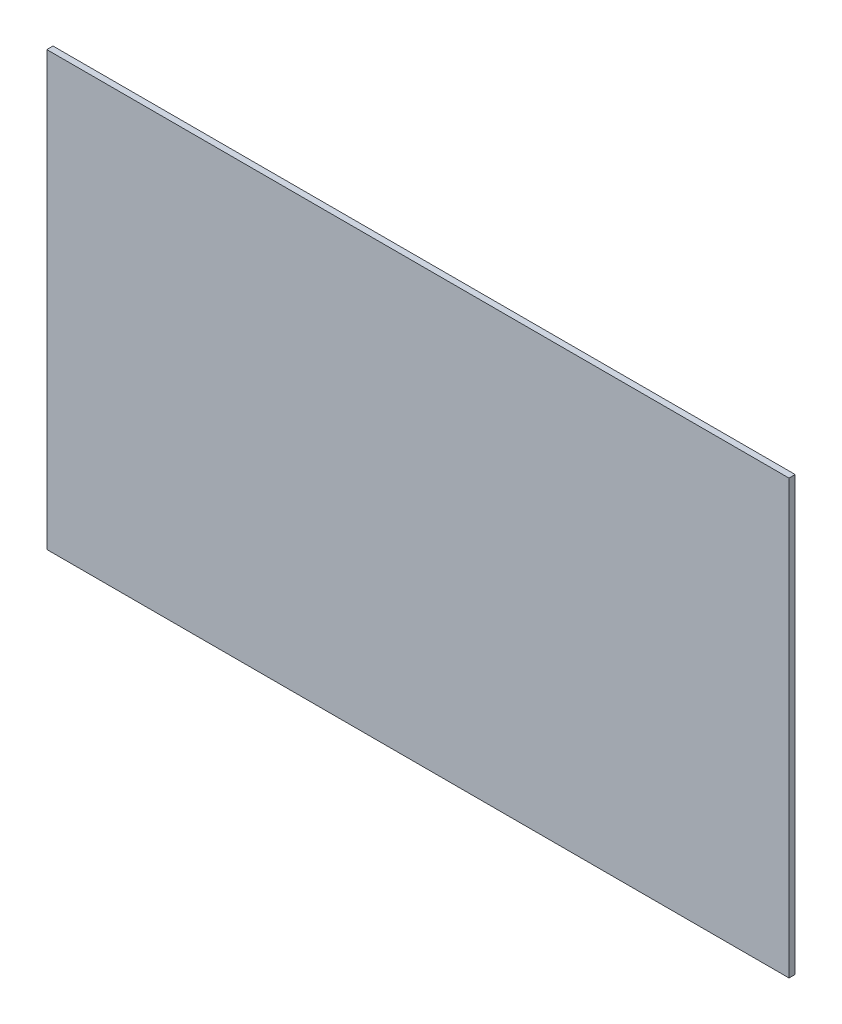
ISO-10303-21;
HEADER;
FILE_DESCRIPTION(('STEP AP214'),'2;1');
FILE_NAME('part.step','',(''),(''),'','','');
FILE_SCHEMA(('AUTOMOTIVE_DESIGN { 1 0 10303 214 1 1 1 1 }'));
ENDSEC;
DATA;
#1=APPLICATION_CONTEXT('core data for automotive mechanical design processes');
#2=APPLICATION_PROTOCOL_DEFINITION('international standard','automotive_design',2000,#1);
#3=PRODUCT_CONTEXT('',#1,'mechanical');
#4=PRODUCT('Part','Part','',(#3));
#5=PRODUCT_RELATED_PRODUCT_CATEGORY('part','',(#4));
#6=PRODUCT_DEFINITION_FORMATION('','',#4);
#7=PRODUCT_DEFINITION_CONTEXT('part definition',#1,'design');
#8=PRODUCT_DEFINITION('design','',#6,#7);
#9=PRODUCT_DEFINITION_SHAPE('','',#8);
#10=(LENGTH_UNIT() NAMED_UNIT(*) SI_UNIT(.MILLI.,.METRE.));
#11=(NAMED_UNIT(*) PLANE_ANGLE_UNIT() SI_UNIT($,.RADIAN.));
#12=(NAMED_UNIT(*) SI_UNIT($,.STERADIAN.) SOLID_ANGLE_UNIT());
#13=UNCERTAINTY_MEASURE_WITH_UNIT(LENGTH_MEASURE(1.E-05),#10,'distance_accuracy_value','');
#14=(GEOMETRIC_REPRESENTATION_CONTEXT(3) GLOBAL_UNCERTAINTY_ASSIGNED_CONTEXT((#13)) GLOBAL_UNIT_ASSIGNED_CONTEXT((#10,
#11,#12)) REPRESENTATION_CONTEXT('',''));
#15=CARTESIAN_POINT('',(0.,0.,0.));
#16=DIRECTION('',(0.,0.,1.));
#17=DIRECTION('',(1.,0.,0.));
#18=AXIS2_PLACEMENT_3D('',#15,#16,#17);
#19=CARTESIAN_POINT('',(0.95,0.15,0.505));
#20=DIRECTION('',(0.,0.,1.));
#21=DIRECTION('',(1.,0.,0.));
#22=AXIS2_PLACEMENT_3D('',#19,#20,#21);
#23=PLANE('',#22);
#24=DIRECTION('',(0.,1.,0.));
#25=VECTOR('',#24,1.);
#26=CARTESIAN_POINT('',(0.95,0.15,0.505));
#27=LINE('',#26,#25);
#28=CARTESIAN_POINT('',(0.95,0.5,0.505));
#29=VERTEX_POINT('',#28);
#30=CARTESIAN_POINT('',(0.95,0.15,0.505));
#31=VERTEX_POINT('',#30);
#32=EDGE_CURVE('E55',#29,#31,#27,.F.);
#33=ORIENTED_EDGE('',*,*,#32,.T.);
#34=DIRECTION('',(1.,0.,0.));
#35=VECTOR('',#34,1.);
#36=CARTESIAN_POINT('',(0.95,0.15,0.505));
#37=LINE('',#36,#35);
#38=CARTESIAN_POINT('',(1.55,0.15,0.505));
#39=VERTEX_POINT('',#38);
#40=EDGE_CURVE('E74',#31,#39,#37,.T.);
#41=ORIENTED_EDGE('',*,*,#40,.T.);
#42=DIRECTION('',(0.,1.,0.));
#43=VECTOR('',#42,1.);
#44=CARTESIAN_POINT('',(1.55,0.15,0.505));
#45=LINE('',#44,#43);
#46=CARTESIAN_POINT('',(1.55,0.5,0.505));
#47=VERTEX_POINT('',#46);
#48=EDGE_CURVE('E66',#47,#39,#45,.F.);
#49=ORIENTED_EDGE('',*,*,#48,.F.);
#50=DIRECTION('',(1.,0.,0.));
#51=VECTOR('',#50,1.);
#52=CARTESIAN_POINT('',(0.95,0.5,0.505));
#53=LINE('',#52,#51);
#54=EDGE_CURVE('E20',#29,#47,#53,.T.);
#55=ORIENTED_EDGE('',*,*,#54,.F.);
#56=EDGE_LOOP('',(#33,#41,#49,#55));
#57=FACE_BOUND('',#56,.T.);
#58=ADVANCED_FACE('F17',(#57),#23,.T.);
#59=CARTESIAN_POINT('',(0.95,0.5,0.5));
#60=DIRECTION('',(0.,1.,0.));
#61=DIRECTION('',(0.,0.,1.));
#62=AXIS2_PLACEMENT_3D('',#59,#60,#61);
#63=PLANE('',#62);
#64=DIRECTION('',(1.,0.,0.));
#65=VECTOR('',#64,1.);
#66=CARTESIAN_POINT('',(0.95,0.5,0.5));
#67=LINE('',#66,#65);
#68=CARTESIAN_POINT('',(1.55,0.5,0.5));
#69=VERTEX_POINT('',#68);
#70=CARTESIAN_POINT('',(0.95,0.5,0.5));
#71=VERTEX_POINT('',#70);
#72=EDGE_CURVE('E72',#69,#71,#67,.F.);
#73=ORIENTED_EDGE('',*,*,#72,.T.);
#74=DIRECTION('',(0.,0.,-1.));
#75=VECTOR('',#74,1.);
#76=CARTESIAN_POINT('',(0.95,0.5,0.5));
#77=LINE('',#76,#75);
#78=EDGE_CURVE('E62',#71,#29,#77,.F.);
#79=ORIENTED_EDGE('',*,*,#78,.T.);
#80=ORIENTED_EDGE('',*,*,#54,.T.);
#81=DIRECTION('',(0.,0.,-1.));
#82=VECTOR('',#81,1.);
#83=CARTESIAN_POINT('',(1.55,0.5,0.5));
#84=LINE('',#83,#82);
#85=EDGE_CURVE('E78',#69,#47,#84,.F.);
#86=ORIENTED_EDGE('',*,*,#85,.F.);
#87=EDGE_LOOP('',(#73,#79,#80,#86));
#88=FACE_BOUND('',#87,.T.);
#89=ADVANCED_FACE('F71',(#88),#63,.T.);
#90=CARTESIAN_POINT('',(0.95,0.15,0.5));
#91=DIRECTION('',(1.,0.,0.));
#92=DIRECTION('',(0.,0.,-1.));
#93=AXIS2_PLACEMENT_3D('',#90,#91,#92);
#94=PLANE('',#93);
#95=DIRECTION('',(0.,1.,0.));
#96=VECTOR('',#95,1.);
#97=CARTESIAN_POINT('',(0.95,0.15,0.5));
#98=LINE('',#97,#96);
#99=CARTESIAN_POINT('',(0.95,0.15,0.5));
#100=VERTEX_POINT('',#99);
#101=EDGE_CURVE('E83',#71,#100,#98,.F.);
#102=ORIENTED_EDGE('',*,*,#101,.T.);
#103=DIRECTION('',(0.,0.,1.));
#104=VECTOR('',#103,1.);
#105=CARTESIAN_POINT('',(0.95,0.15,0.5));
#106=LINE('',#105,#104);
#107=EDGE_CURVE('E64',#100,#31,#106,.T.);
#108=ORIENTED_EDGE('',*,*,#107,.T.);
#109=ORIENTED_EDGE('',*,*,#32,.F.);
#110=ORIENTED_EDGE('',*,*,#78,.F.);
#111=EDGE_LOOP('',(#102,#108,#109,#110));
#112=FACE_BOUND('',#111,.T.);
#113=ADVANCED_FACE('F60',(#112),#94,.F.);
#114=CARTESIAN_POINT('',(0.95,0.15,0.5));
#115=DIRECTION('',(0.,1.,0.));
#116=DIRECTION('',(0.,0.,1.));
#117=AXIS2_PLACEMENT_3D('',#114,#115,#116);
#118=PLANE('',#117);
#119=ORIENTED_EDGE('',*,*,#107,.F.);
#120=DIRECTION('',(1.,0.,0.));
#121=VECTOR('',#120,1.);
#122=CARTESIAN_POINT('',(0.95,0.15,0.5));
#123=LINE('',#122,#121);
#124=CARTESIAN_POINT('',(1.55,0.15,0.5));
#125=VERTEX_POINT('',#124);
#126=EDGE_CURVE('E26',#100,#125,#123,.T.);
#127=ORIENTED_EDGE('',*,*,#126,.T.);
#128=DIRECTION('',(0.,0.,-1.));
#129=VECTOR('',#128,1.);
#130=CARTESIAN_POINT('',(1.55,0.15,0.5));
#131=LINE('',#130,#129);
#132=EDGE_CURVE('E34',#39,#125,#131,.T.);
#133=ORIENTED_EDGE('',*,*,#132,.F.);
#134=ORIENTED_EDGE('',*,*,#40,.F.);
#135=EDGE_LOOP('',(#119,#127,#133,#134));
#136=FACE_BOUND('',#135,.T.);
#137=ADVANCED_FACE('F88',(#136),#118,.F.);
#138=CARTESIAN_POINT('',(1.55,0.15,0.5));
#139=DIRECTION('',(1.,0.,0.));
#140=DIRECTION('',(0.,0.,-1.));
#141=AXIS2_PLACEMENT_3D('',#138,#139,#140);
#142=PLANE('',#141);
#143=ORIENTED_EDGE('',*,*,#132,.T.);
#144=DIRECTION('',(0.,1.,0.));
#145=VECTOR('',#144,1.);
#146=CARTESIAN_POINT('',(1.55,0.15,0.5));
#147=LINE('',#146,#145);
#148=EDGE_CURVE('E11',#125,#69,#147,.T.);
#149=ORIENTED_EDGE('',*,*,#148,.T.);
#150=ORIENTED_EDGE('',*,*,#85,.T.);
#151=ORIENTED_EDGE('',*,*,#48,.T.);
#152=EDGE_LOOP('',(#143,#149,#150,#151));
#153=FACE_BOUND('',#152,.T.);
#154=ADVANCED_FACE('F91',(#153),#142,.T.);
#155=CARTESIAN_POINT('',(0.95,0.15,0.5));
#156=DIRECTION('',(0.,0.,1.));
#157=DIRECTION('',(1.,0.,0.));
#158=AXIS2_PLACEMENT_3D('',#155,#156,#157);
#159=PLANE('',#158);
#160=ORIENTED_EDGE('',*,*,#126,.F.);
#161=ORIENTED_EDGE('',*,*,#101,.F.);
#162=ORIENTED_EDGE('',*,*,#72,.F.);
#163=ORIENTED_EDGE('',*,*,#148,.F.);
#164=EDGE_LOOP('',(#160,#161,#162,#163));
#165=FACE_BOUND('',#164,.T.);
#166=ADVANCED_FACE('F90',(#165),#159,.F.);
#167=CLOSED_SHELL('',(#58,#89,#113,#137,#154,#166));
#168=MANIFOLD_SOLID_BREP('B1',#167);
#169=ADVANCED_BREP_SHAPE_REPRESENTATION('',(#18,#168),#14);
#170=SHAPE_DEFINITION_REPRESENTATION(#9,#169);
ENDSEC;
END-ISO-10303-21;
